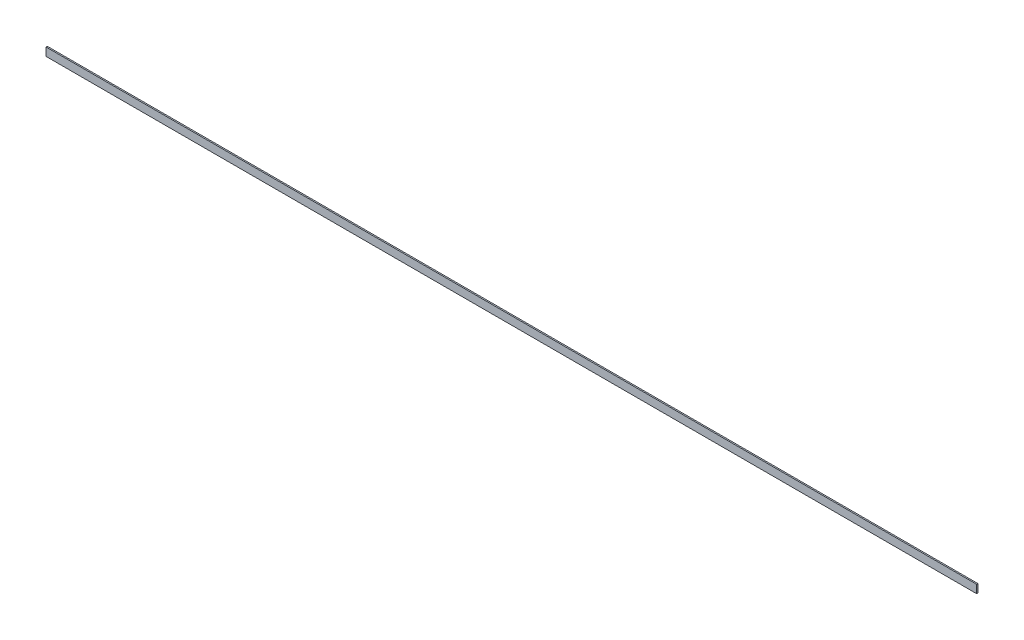
ISO-10303-21;
HEADER;
FILE_DESCRIPTION(('STEP AP214'),'2;1');
FILE_NAME('part.step','',(''),(''),'','','');
FILE_SCHEMA(('AUTOMOTIVE_DESIGN { 1 0 10303 214 1 1 1 1 }'));
ENDSEC;
DATA;
#1=APPLICATION_CONTEXT('core data for automotive mechanical design processes');
#2=APPLICATION_PROTOCOL_DEFINITION('international standard','automotive_design',2000,#1);
#3=PRODUCT_CONTEXT('',#1,'mechanical');
#4=PRODUCT('Part','Part','',(#3));
#5=PRODUCT_RELATED_PRODUCT_CATEGORY('part','',(#4));
#6=PRODUCT_DEFINITION_FORMATION('','',#4);
#7=PRODUCT_DEFINITION_CONTEXT('part definition',#1,'design');
#8=PRODUCT_DEFINITION('design','',#6,#7);
#9=PRODUCT_DEFINITION_SHAPE('','',#8);
#10=(LENGTH_UNIT() NAMED_UNIT(*) SI_UNIT(.MILLI.,.METRE.));
#11=(NAMED_UNIT(*) PLANE_ANGLE_UNIT() SI_UNIT($,.RADIAN.));
#12=(NAMED_UNIT(*) SI_UNIT($,.STERADIAN.) SOLID_ANGLE_UNIT());
#13=UNCERTAINTY_MEASURE_WITH_UNIT(LENGTH_MEASURE(1.E-05),#10,'distance_accuracy_value','');
#14=(GEOMETRIC_REPRESENTATION_CONTEXT(3) GLOBAL_UNCERTAINTY_ASSIGNED_CONTEXT((#13)) GLOBAL_UNIT_ASSIGNED_CONTEXT((#10,
#11,#12)) REPRESENTATION_CONTEXT('',''));
#15=CARTESIAN_POINT('',(0.,0.,0.));
#16=DIRECTION('',(0.,0.,1.));
#17=DIRECTION('',(1.,0.,0.));
#18=AXIS2_PLACEMENT_3D('',#15,#16,#17);
#19=CARTESIAN_POINT('',(304.223298510016,39.2963665468867,0.7));
#20=DIRECTION('',(-1.,0.,0.));
#21=DIRECTION('',(0.,0.,1.));
#22=AXIS2_PLACEMENT_3D('',#19,#20,#21);
#23=PLANE('',#22);
#24=DIRECTION('',(0.,1.,0.));
#25=VECTOR('',#24,1.);
#26=CARTESIAN_POINT('',(304.223298510016,39.2963665468867,0.));
#27=LINE('',#26,#25);
#28=CARTESIAN_POINT('',(304.223298510016,39.2963665468867,0.));
#29=VERTEX_POINT('',#28);
#30=CARTESIAN_POINT('',(304.223298510016,43.7963665468867,0.));
#31=VERTEX_POINT('',#30);
#32=EDGE_CURVE('E97',#29,#31,#27,.T.);
#33=ORIENTED_EDGE('',*,*,#32,.T.);
#34=DIRECTION('',(0.,0.,-1.));
#35=VECTOR('',#34,1.);
#36=CARTESIAN_POINT('',(304.223298510016,43.7963665468867,0.7));
#37=LINE('',#36,#35);
#38=CARTESIAN_POINT('',(304.223298510016,43.7963665468867,0.7));
#39=VERTEX_POINT('',#38);
#40=EDGE_CURVE('E11',#39,#31,#37,.T.);
#41=ORIENTED_EDGE('',*,*,#40,.F.);
#42=DIRECTION('',(0.,1.,0.));
#43=VECTOR('',#42,1.);
#44=CARTESIAN_POINT('',(304.223298510016,39.2963665468867,0.7));
#45=LINE('',#44,#43);
#46=CARTESIAN_POINT('',(304.223298510016,39.2963665468867,0.7));
#47=VERTEX_POINT('',#46);
#48=EDGE_CURVE('E85',#47,#39,#45,.T.);
#49=ORIENTED_EDGE('',*,*,#48,.F.);
#50=DIRECTION('',(0.,0.,-1.));
#51=VECTOR('',#50,1.);
#52=CARTESIAN_POINT('',(304.223298510016,39.2963665468867,0.7));
#53=LINE('',#52,#51);
#54=EDGE_CURVE('E93',#47,#29,#53,.T.);
#55=ORIENTED_EDGE('',*,*,#54,.T.);
#56=EDGE_LOOP('',(#33,#41,#49,#55));
#57=FACE_BOUND('',#56,.T.);
#58=ADVANCED_FACE('F34',(#57),#23,.F.);
#59=CARTESIAN_POINT('',(304.223298510016,43.7963665468867,0.7));
#60=DIRECTION('',(0.,-1.,0.));
#61=DIRECTION('',(0.,0.,-1.));
#62=AXIS2_PLACEMENT_3D('',#59,#60,#61);
#63=PLANE('',#62);
#64=DIRECTION('',(-1.,0.,0.));
#65=VECTOR('',#64,1.);
#66=CARTESIAN_POINT('',(304.223298510016,43.7963665468867,0.));
#67=LINE('',#66,#65);
#68=CARTESIAN_POINT('',(-208.577911130274,43.7963665468867,0.));
#69=VERTEX_POINT('',#68);
#70=EDGE_CURVE('E89',#31,#69,#67,.T.);
#71=ORIENTED_EDGE('',*,*,#70,.T.);
#72=DIRECTION('',(0.,0.,-1.));
#73=VECTOR('',#72,1.);
#74=CARTESIAN_POINT('',(-208.577911130274,43.7963665468867,0.7));
#75=LINE('',#74,#73);
#76=CARTESIAN_POINT('',(-208.577911130274,43.7963665468867,0.7));
#77=VERTEX_POINT('',#76);
#78=EDGE_CURVE('E42',#77,#69,#75,.T.);
#79=ORIENTED_EDGE('',*,*,#78,.F.);
#80=DIRECTION('',(-1.,0.,0.));
#81=VECTOR('',#80,1.);
#82=CARTESIAN_POINT('',(304.223298510016,43.7963665468867,0.7));
#83=LINE('',#82,#81);
#84=EDGE_CURVE('E80',#39,#77,#83,.T.);
#85=ORIENTED_EDGE('',*,*,#84,.F.);
#86=ORIENTED_EDGE('',*,*,#40,.T.);
#87=EDGE_LOOP('',(#71,#79,#85,#86));
#88=FACE_BOUND('',#87,.T.);
#89=ADVANCED_FACE('F88',(#88),#63,.F.);
#90=CARTESIAN_POINT('',(-208.577911130274,39.2963665468867,0.7));
#91=DIRECTION('',(1.,0.,0.));
#92=DIRECTION('',(0.,0.,-1.));
#93=AXIS2_PLACEMENT_3D('',#90,#91,#92);
#94=PLANE('',#93);
#95=DIRECTION('',(0.,-1.,0.));
#96=VECTOR('',#95,1.);
#97=CARTESIAN_POINT('',(-208.577911130274,39.2963665468867,0.));
#98=LINE('',#97,#96);
#99=CARTESIAN_POINT('',(-208.577911130274,39.2963665468867,0.));
#100=VERTEX_POINT('',#99);
#101=EDGE_CURVE('E67',#69,#100,#98,.T.);
#102=ORIENTED_EDGE('',*,*,#101,.T.);
#103=DIRECTION('',(0.,0.,-1.));
#104=VECTOR('',#103,1.);
#105=CARTESIAN_POINT('',(-208.577911130274,39.2963665468867,0.7));
#106=LINE('',#105,#104);
#107=CARTESIAN_POINT('',(-208.577911130274,39.2963665468867,0.7));
#108=VERTEX_POINT('',#107);
#109=EDGE_CURVE('E90',#108,#100,#106,.T.);
#110=ORIENTED_EDGE('',*,*,#109,.F.);
#111=DIRECTION('',(0.,-1.,0.));
#112=VECTOR('',#111,1.);
#113=CARTESIAN_POINT('',(-208.577911130274,39.2963665468867,0.7));
#114=LINE('',#113,#112);
#115=EDGE_CURVE('E83',#77,#108,#114,.T.);
#116=ORIENTED_EDGE('',*,*,#115,.F.);
#117=ORIENTED_EDGE('',*,*,#78,.T.);
#118=EDGE_LOOP('',(#102,#110,#116,#117));
#119=FACE_BOUND('',#118,.T.);
#120=ADVANCED_FACE('F91',(#119),#94,.F.);
#121=CARTESIAN_POINT('',(304.223298510016,39.2963665468867,0.7));
#122=DIRECTION('',(0.,1.,0.));
#123=DIRECTION('',(-1.,0.,0.));
#124=AXIS2_PLACEMENT_3D('',#121,#122,#123);
#125=PLANE('',#124);
#126=DIRECTION('',(1.,0.,0.));
#127=VECTOR('',#126,1.);
#128=CARTESIAN_POINT('',(304.223298510016,39.2963665468867,0.));
#129=LINE('',#128,#127);
#130=EDGE_CURVE('E73',#100,#29,#129,.T.);
#131=ORIENTED_EDGE('',*,*,#130,.T.);
#132=ORIENTED_EDGE('',*,*,#54,.F.);
#133=DIRECTION('',(1.,0.,0.));
#134=VECTOR('',#133,1.);
#135=CARTESIAN_POINT('',(304.223298510016,39.2963665468867,0.7));
#136=LINE('',#135,#134);
#137=EDGE_CURVE('E50',#108,#47,#136,.T.);
#138=ORIENTED_EDGE('',*,*,#137,.F.);
#139=ORIENTED_EDGE('',*,*,#109,.T.);
#140=EDGE_LOOP('',(#131,#132,#138,#139));
#141=FACE_BOUND('',#140,.T.);
#142=ADVANCED_FACE('F104',(#141),#125,.F.);
#143=CARTESIAN_POINT('',(0.,0.,0.7));
#144=DIRECTION('',(0.,0.,1.));
#145=DIRECTION('',(1.,0.,0.));
#146=AXIS2_PLACEMENT_3D('',#143,#144,#145);
#147=PLANE('',#146);
#148=ORIENTED_EDGE('',*,*,#48,.T.);
#149=ORIENTED_EDGE('',*,*,#84,.T.);
#150=ORIENTED_EDGE('',*,*,#115,.T.);
#151=ORIENTED_EDGE('',*,*,#137,.T.);
#152=EDGE_LOOP('',(#148,#149,#150,#151));
#153=FACE_BOUND('',#152,.T.);
#154=ADVANCED_FACE('F81',(#153),#147,.T.);
#155=CARTESIAN_POINT('',(0.,0.,0.));
#156=DIRECTION('',(0.,0.,1.));
#157=DIRECTION('',(1.,0.,0.));
#158=AXIS2_PLACEMENT_3D('',#155,#156,#157);
#159=PLANE('',#158);
#160=ORIENTED_EDGE('',*,*,#32,.F.);
#161=ORIENTED_EDGE('',*,*,#130,.F.);
#162=ORIENTED_EDGE('',*,*,#101,.F.);
#163=ORIENTED_EDGE('',*,*,#70,.F.);
#164=EDGE_LOOP('',(#160,#161,#162,#163));
#165=FACE_BOUND('',#164,.T.);
#166=ADVANCED_FACE('F107',(#165),#159,.F.);
#167=CLOSED_SHELL('',(#58,#89,#120,#142,#154,#166));
#168=MANIFOLD_SOLID_BREP('B2',#167);
#169=ADVANCED_BREP_SHAPE_REPRESENTATION('',(#18,#168),#14);
#170=SHAPE_DEFINITION_REPRESENTATION(#9,#169);
ENDSEC;
END-ISO-10303-21;
